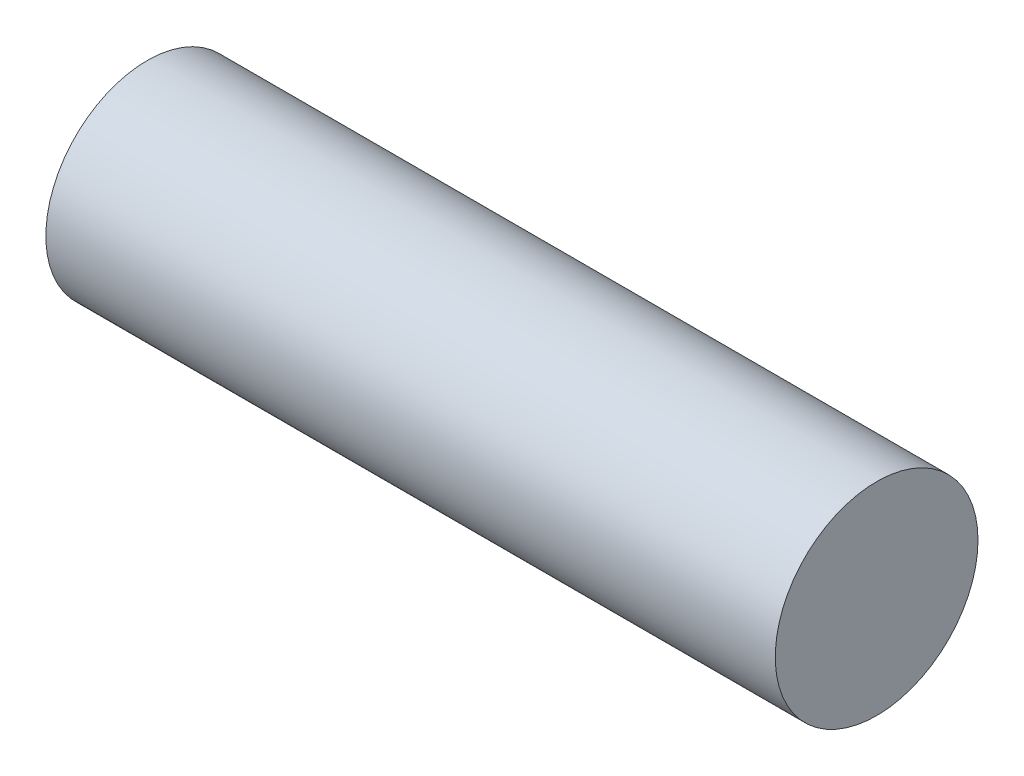
ISO-10303-21;
HEADER;
FILE_DESCRIPTION(('STEP AP214'),'2;1');
FILE_NAME('part.step','',(''),(''),'','','');
FILE_SCHEMA(('AUTOMOTIVE_DESIGN { 1 0 10303 214 1 1 1 1 }'));
ENDSEC;
DATA;
#1=APPLICATION_CONTEXT('core data for automotive mechanical design processes');
#2=APPLICATION_PROTOCOL_DEFINITION('international standard','automotive_design',2000,#1);
#3=PRODUCT_CONTEXT('',#1,'mechanical');
#4=PRODUCT('Part','Part','',(#3));
#5=PRODUCT_RELATED_PRODUCT_CATEGORY('part','',(#4));
#6=PRODUCT_DEFINITION_FORMATION('','',#4);
#7=PRODUCT_DEFINITION_CONTEXT('part definition',#1,'design');
#8=PRODUCT_DEFINITION('design','',#6,#7);
#9=PRODUCT_DEFINITION_SHAPE('','',#8);
#10=(LENGTH_UNIT() NAMED_UNIT(*) SI_UNIT(.MILLI.,.METRE.));
#11=(NAMED_UNIT(*) PLANE_ANGLE_UNIT() SI_UNIT($,.RADIAN.));
#12=(NAMED_UNIT(*) SI_UNIT($,.STERADIAN.) SOLID_ANGLE_UNIT());
#13=UNCERTAINTY_MEASURE_WITH_UNIT(LENGTH_MEASURE(1.E-05),#10,'distance_accuracy_value','');
#14=(GEOMETRIC_REPRESENTATION_CONTEXT(3) GLOBAL_UNCERTAINTY_ASSIGNED_CONTEXT((#13)) GLOBAL_UNIT_ASSIGNED_CONTEXT((#10,
#11,#12)) REPRESENTATION_CONTEXT('',''));
#15=CARTESIAN_POINT('',(0.,0.,0.));
#16=DIRECTION('',(0.,0.,1.));
#17=DIRECTION('',(1.,0.,0.));
#18=AXIS2_PLACEMENT_3D('',#15,#16,#17);
#19=CARTESIAN_POINT('',(14.986,0.,0.));
#20=DIRECTION('',(-1.,0.,0.));
#21=DIRECTION('',(0.,0.,1.));
#22=AXIS2_PLACEMENT_3D('',#19,#20,#21);
#23=CYLINDRICAL_SURFACE('',#22,2.0828);
#24=CARTESIAN_POINT('',(14.986,0.,0.));
#25=DIRECTION('',(1.,0.,0.));
#26=DIRECTION('',(0.,0.,-1.));
#27=AXIS2_PLACEMENT_3D('',#24,#25,#26);
#28=CIRCLE('',#27,2.0828);
#29=CARTESIAN_POINT('',(14.986,0.,-2.0828));
#30=VERTEX_POINT('',#29);
#31=EDGE_CURVE('E10',#30,#30,#28,.T.);
#32=ORIENTED_EDGE('',*,*,#31,.F.);
#33=EDGE_LOOP('',(#32));
#34=FACE_BOUND('',#33,.T.);
#35=CARTESIAN_POINT('',(0.,0.,0.));
#36=DIRECTION('',(1.,0.,0.));
#37=DIRECTION('',(0.,0.,-1.));
#38=AXIS2_PLACEMENT_3D('',#35,#36,#37);
#39=CIRCLE('',#38,2.0828);
#40=CARTESIAN_POINT('',(0.,0.,-2.0828));
#41=VERTEX_POINT('',#40);
#42=EDGE_CURVE('E37',#41,#41,#39,.T.);
#43=ORIENTED_EDGE('',*,*,#42,.T.);
#44=EDGE_LOOP('',(#43));
#45=FACE_BOUND('',#44,.T.);
#46=ADVANCED_FACE('F34',(#34,#45),#23,.T.);
#47=CARTESIAN_POINT('',(14.986,0.,0.));
#48=DIRECTION('',(1.,0.,0.));
#49=DIRECTION('',(0.,0.,-1.));
#50=AXIS2_PLACEMENT_3D('',#47,#48,#49);
#51=PLANE('',#50);
#52=ORIENTED_EDGE('',*,*,#31,.T.);
#53=EDGE_LOOP('',(#52));
#54=FACE_BOUND('',#53,.T.);
#55=ADVANCED_FACE('F49',(#54),#51,.T.);
#56=CARTESIAN_POINT('',(0.,0.,0.));
#57=DIRECTION('',(1.,0.,0.));
#58=DIRECTION('',(0.,0.,-1.));
#59=AXIS2_PLACEMENT_3D('',#56,#57,#58);
#60=PLANE('',#59);
#61=ORIENTED_EDGE('',*,*,#42,.F.);
#62=EDGE_LOOP('',(#61));
#63=FACE_BOUND('',#62,.T.);
#64=ADVANCED_FACE('F47',(#63),#60,.F.);
#65=CLOSED_SHELL('',(#46,#55,#64));
#66=MANIFOLD_SOLID_BREP('B2',#65);
#67=ADVANCED_BREP_SHAPE_REPRESENTATION('',(#18,#66),#14);
#68=SHAPE_DEFINITION_REPRESENTATION(#9,#67);
ENDSEC;
END-ISO-10303-21;
